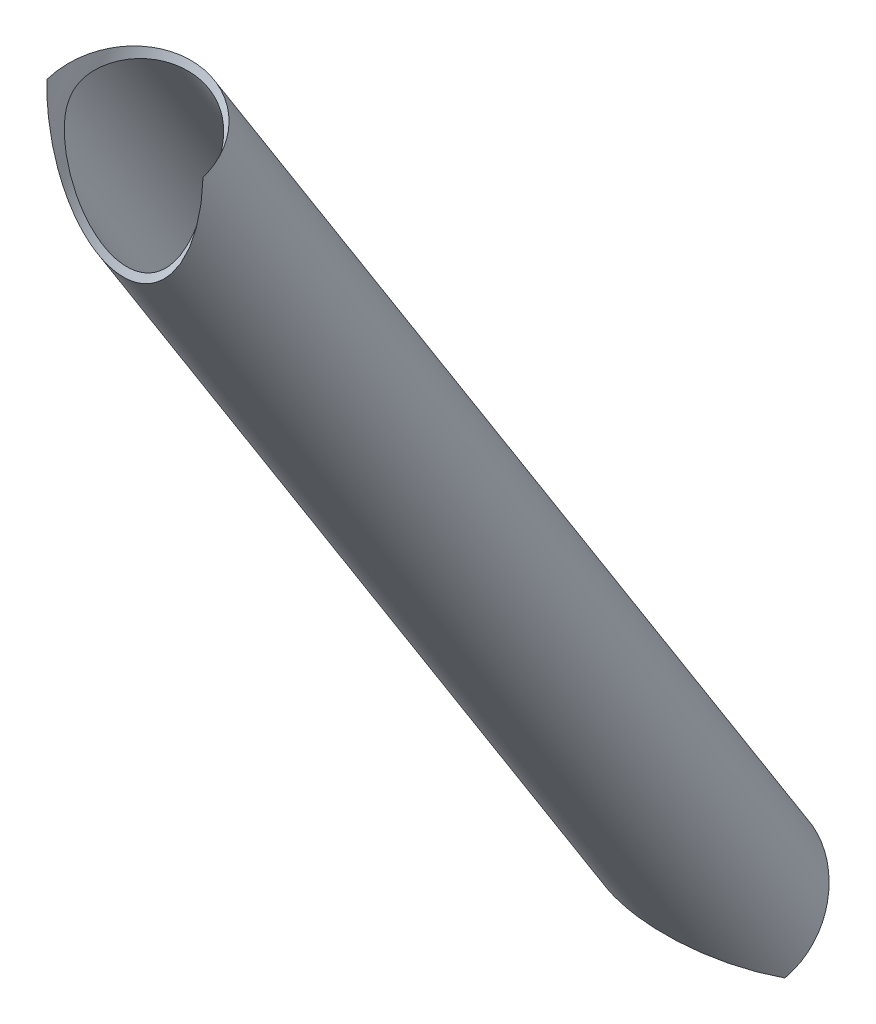
ISO-10303-21;
HEADER;
FILE_DESCRIPTION(('STEP AP214'),'2;1');
FILE_NAME('part.step','',(''),(''),'','','');
FILE_SCHEMA(('AUTOMOTIVE_DESIGN { 1 0 10303 214 1 1 1 1 }'));
ENDSEC;
DATA;
#1=APPLICATION_CONTEXT('core data for automotive mechanical design processes');
#2=APPLICATION_PROTOCOL_DEFINITION('international standard','automotive_design',2000,#1);
#3=PRODUCT_CONTEXT('',#1,'mechanical');
#4=PRODUCT('Part','Part','',(#3));
#5=PRODUCT_RELATED_PRODUCT_CATEGORY('part','',(#4));
#6=PRODUCT_DEFINITION_FORMATION('','',#4);
#7=PRODUCT_DEFINITION_CONTEXT('part definition',#1,'design');
#8=PRODUCT_DEFINITION('design','',#6,#7);
#9=PRODUCT_DEFINITION_SHAPE('','',#8);
#10=(LENGTH_UNIT() NAMED_UNIT(*) SI_UNIT(.MILLI.,.METRE.));
#11=(NAMED_UNIT(*) PLANE_ANGLE_UNIT() SI_UNIT($,.RADIAN.));
#12=(NAMED_UNIT(*) SI_UNIT($,.STERADIAN.) SOLID_ANGLE_UNIT());
#13=UNCERTAINTY_MEASURE_WITH_UNIT(LENGTH_MEASURE(1.E-05),#10,'distance_accuracy_value','');
#14=(GEOMETRIC_REPRESENTATION_CONTEXT(3) GLOBAL_UNCERTAINTY_ASSIGNED_CONTEXT((#13)) GLOBAL_UNIT_ASSIGNED_CONTEXT((#10,
#11,#12)) REPRESENTATION_CONTEXT('',''));
#15=CARTESIAN_POINT('',(0.,0.,0.));
#16=DIRECTION('',(0.,0.,1.));
#17=DIRECTION('',(1.,0.,0.));
#18=AXIS2_PLACEMENT_3D('',#15,#16,#17);
#19=CARTESIAN_POINT('',(-182.5,460.,-1823.25662851832));
#20=DIRECTION('',(-0.220873286514699,-0.785327240941153,-0.578339101168122));
#21=DIRECTION('',(0.,0.592984323970811,-0.805214003557366));
#22=AXIS2_PLACEMENT_3D('',#19,#20,#21);
#23=CYLINDRICAL_SURFACE('',#22,11.3);
#24=CARTESIAN_POINT('',(-184.024204881158,461.281327727865,-1836.34655578851));
#25=CARTESIAN_POINT('',(-184.323553613901,461.335954504744,-1836.30632737413));
#26=CARTESIAN_POINT('',(-184.621930067285,461.386594875416,-1836.25349007966));
#27=CARTESIAN_POINT('',(-185.214539448558,461.479495202312,-1836.12305444516));
#28=CARTESIAN_POINT('',(-185.508772469279,461.521755346569,-1836.04545666079));
#29=CARTESIAN_POINT('',(-186.090963235994,461.597484679827,-1835.86625950878));
#30=CARTESIAN_POINT('',(-186.378921455805,461.630954534719,-1835.76466196028));
#31=CARTESIAN_POINT('',(-186.946612850392,461.688697408685,-1835.53848804046));
#32=CARTESIAN_POINT('',(-187.226345963661,461.712970359001,-1835.41391149734));
#33=CARTESIAN_POINT('',(-187.775279880089,461.751858964316,-1835.14329734052));
#34=CARTESIAN_POINT('',(-188.04449896651,461.766492156477,-1834.99729929318));
#35=CARTESIAN_POINT('',(-188.571348461809,461.785713959871,-1834.68514466943));
#36=CARTESIAN_POINT('',(-188.828978853616,461.790302556306,-1834.51898806334));
#37=CARTESIAN_POINT('',(-189.331357114136,461.788907778094,-1834.16810242285));
#38=CARTESIAN_POINT('',(-189.576100456341,461.782920713975,-1833.98336692814));
#39=CARTESIAN_POINT('',(-190.051444188771,461.759722834002,-1833.59717825439));
#40=CARTESIAN_POINT('',(-190.282044515489,461.742511967751,-1833.39572500027));
#41=CARTESIAN_POINT('',(-190.735829756907,461.695240267927,-1832.97087162092));
#42=CARTESIAN_POINT('',(-190.958487513457,461.664758170798,-1832.74695519856));
#43=CARTESIAN_POINT('',(-191.386880854566,461.589670742868,-1832.28565147192));
#44=CARTESIAN_POINT('',(-191.5926141984,461.54506354574,-1832.04826239091));
#45=CARTESIAN_POINT('',(-191.986565554855,461.440034695859,-1831.56266087408));
#46=CARTESIAN_POINT('',(-192.174782170627,461.379611783365,-1831.31444757739));
#47=CARTESIAN_POINT('',(-192.533285443976,461.240617421031,-1830.81032426458));
#48=CARTESIAN_POINT('',(-192.703577936949,461.162051904488,-1830.55441678847));
#49=CARTESIAN_POINT('',(-192.977845384662,461.010219880977,-1830.11592165355));
#50=CARTESIAN_POINT('',(-193.086418185348,460.942400757102,-1829.93430496298));
#51=CARTESIAN_POINT('',(-193.294731563619,460.794759771125,-1829.57083901728));
#52=CARTESIAN_POINT('',(-193.394472296704,460.714938120409,-1829.3889897663));
#53=CARTESIAN_POINT('',(-193.584993060671,460.54172302272,-1829.02751104852));
#54=CARTESIAN_POINT('',(-193.675788582601,460.448353756299,-1828.84787823285));
#55=CARTESIAN_POINT('',(-193.848691834266,460.24602714701,-1828.49324986406));
#56=CARTESIAN_POINT('',(-193.930802458362,460.137075025996,-1828.31825278069));
#57=CARTESIAN_POINT('',(-194.06667551204,459.931692485741,-1828.01983334388));
#58=CARTESIAN_POINT('',(-194.122336072138,459.839126269199,-1827.89461469224));
#59=CARTESIAN_POINT('',(-194.228984149652,459.64375151545,-1827.65034924495));
#60=CARTESIAN_POINT('',(-194.279973136397,459.540946220074,-1827.53130051386));
#61=CARTESIAN_POINT('',(-194.377309978102,459.32503336055,-1827.30131631877));
#62=CARTESIAN_POINT('',(-194.423666293213,459.211945323999,-1827.19036616897));
#63=CARTESIAN_POINT('',(-194.511996792571,458.975549814307,-1826.97799854435));
#64=CARTESIAN_POINT('',(-194.553971099055,458.852242626401,-1826.87658080363));
#65=CARTESIAN_POINT('',(-194.633863723794,458.595823565967,-1826.68431331347));
#66=CARTESIAN_POINT('',(-194.671769957443,458.462684361917,-1826.59349498429));
#67=CARTESIAN_POINT('',(-194.743661025288,458.188177346002,-1826.42351607816));
#68=CARTESIAN_POINT('',(-194.777645787834,458.046809383857,-1826.34435571421));
#69=CARTESIAN_POINT('',(-194.842055684005,457.757182614636,-1826.19768579186));
#70=CARTESIAN_POINT('',(-194.872476449364,457.60891565619,-1826.13019048377));
#71=CARTESIAN_POINT('',(-194.930061181261,457.30712897592,-1826.00643677696));
#72=CARTESIAN_POINT('',(-194.957223852073,457.153607195274,-1825.950182843));
#73=CARTESIAN_POINT('',(-195.023626935419,456.751922618083,-1825.8182083421));
#74=CARTESIAN_POINT('',(-195.060661730889,456.500827561612,-1825.75029329837));
#75=CARTESIAN_POINT('',(-195.128517738162,455.992973988207,-1825.63598739043));
#76=CARTESIAN_POINT('',(-195.159334143702,455.736211259412,-1825.58961313957));
#77=CARTESIAN_POINT('',(-195.215689455789,455.218383336576,-1825.51391011556));
#78=CARTESIAN_POINT('',(-195.241201468676,454.957303131944,-1825.48466690071));
#79=CARTESIAN_POINT('',(-195.28730305673,454.433675944943,-1825.43994767855));
#80=CARTESIAN_POINT('',(-195.307894094135,454.171129422071,-1825.42446757788));
#81=CARTESIAN_POINT('',(-195.340971559691,453.696122332912,-1825.4063507416));
#82=CARTESIAN_POINT('',(-195.354255204053,453.48378218387,-1825.40181086279));
#83=CARTESIAN_POINT('',(-195.377955818773,453.058890911858,-1825.3986740033));
#84=CARTESIAN_POINT('',(-195.38837256219,452.846339773523,-1825.40007749295));
#85=CARTESIAN_POINT('',(-195.41543240481,452.208472235557,-1825.41174057995));
#86=CARTESIAN_POINT('',(-195.427873681919,451.783107967822,-1825.42945752713));
#87=CARTESIAN_POINT('',(-195.44167149081,450.932282751536,-1825.47931061697));
#88=CARTESIAN_POINT('',(-195.443006089253,450.506823270153,-1825.5114751587));
#89=CARTESIAN_POINT('',(-195.434262975122,449.657089222422,-1825.58665943162));
#90=CARTESIAN_POINT('',(-195.424187803973,449.232814413296,-1825.6296767438));
#91=CARTESIAN_POINT('',(-195.392117567108,448.385997095791,-1825.72409466736));
#92=CARTESIAN_POINT('',(-195.370131852838,447.963453490065,-1825.77548867974));
#93=CARTESIAN_POINT('',(-195.313498875732,447.120052311968,-1825.88499828641));
#94=CARTESIAN_POINT('',(-195.278850598224,446.699194877445,-1825.94311441909));
#95=CARTESIAN_POINT('',(-195.195980551839,445.86018603833,-1826.06476928709));
#96=CARTESIAN_POINT('',(-195.147777239284,445.442031739699,-1826.12830056781));
#97=CARTESIAN_POINT('',(-195.03657119588,444.608461561789,-1826.25995622661));
#98=CARTESIAN_POINT('',(-194.973570343192,444.193045341855,-1826.32808002099));
#99=CARTESIAN_POINT('',(-194.835257111015,443.388954942772,-1826.46430756217));
#100=CARTESIAN_POINT('',(-194.760837343819,443.000091700452,-1826.53219659299));
#101=CARTESIAN_POINT('',(-194.595874691941,442.226269317608,-1826.67102948074));
#102=CARTESIAN_POINT('',(-194.505329740377,441.84131068426,-1826.74197372838));
#103=CARTESIAN_POINT('',(-194.305903568722,441.075548098076,-1826.88671669953));
#104=CARTESIAN_POINT('',(-194.196974323796,440.694757882659,-1826.96052249886));
#105=CARTESIAN_POINT('',(-193.958504176332,439.940143668228,-1827.110440644));
#106=CARTESIAN_POINT('',(-193.828965889813,439.566318791783,-1827.18655269607));
#107=CARTESIAN_POINT('',(-193.543752991829,438.821691282313,-1827.34203581847));
#108=CARTESIAN_POINT('',(-193.387666700964,438.451051559366,-1827.4214404404));
#109=CARTESIAN_POINT('',(-193.0467863388,437.723052788229,-1827.58179537061));
#110=CARTESIAN_POINT('',(-192.861972264935,437.365703210181,-1827.66274672113));
#111=CARTESIAN_POINT('',(-192.460022967745,436.67268810011,-1827.82485146023));
#112=CARTESIAN_POINT('',(-192.243108135542,436.336895497729,-1827.90600002485));
#113=CARTESIAN_POINT('',(-191.77080699035,435.69387170632,-1828.0676638966));
#114=CARTESIAN_POINT('',(-191.515501191727,435.386582869243,-1828.14818016648));
#115=CARTESIAN_POINT('',(-191.013610099314,434.868050864994,-1828.29153035546));
#116=CARTESIAN_POINT('',(-190.774664950983,434.649671246928,-1828.35480547421));
#117=CARTESIAN_POINT('',(-190.3937616649,434.349950688631,-1828.44709712122));
#118=CARTESIAN_POINT('',(-190.263014928293,434.254667337109,-1828.4774305786));
#119=CARTESIAN_POINT('',(-189.99415184129,434.07478418174,-1828.53694556083));
#120=CARTESIAN_POINT('',(-189.856038746597,433.990179712912,-1828.56612758481));
#121=CARTESIAN_POINT('',(-189.571228767432,433.832185505735,-1828.62335429927));
#122=CARTESIAN_POINT('',(-189.424454041853,433.758929675938,-1828.65138290593));
#123=CARTESIAN_POINT('',(-189.124468605747,433.626161737599,-1828.70561974174));
#124=CARTESIAN_POINT('',(-188.971258078392,433.566649238215,-1828.73182802263));
#125=CARTESIAN_POINT('',(-188.659624208332,433.462567635358,-1828.78207653217));
#126=CARTESIAN_POINT('',(-188.501205199975,433.417986435664,-1828.8061185042));
#127=CARTESIAN_POINT('',(-188.180438596785,433.344469790881,-1828.85177396443));
#128=CARTESIAN_POINT('',(-188.018091353504,433.315532951088,-1828.87338766899));
#129=CARTESIAN_POINT('',(-187.708603863055,433.275811873422,-1828.91180244538));
#130=CARTESIAN_POINT('',(-187.561700920985,433.263413101788,-1828.92887106665));
#131=CARTESIAN_POINT('',(-187.267094578329,433.251108974171,-1828.96083635917));
#132=CARTESIAN_POINT('',(-187.11939093017,433.251207732027,-1828.97573231362));
#133=CARTESIAN_POINT('',(-186.824253962499,433.263447903108,-1829.00333076788));
#134=CARTESIAN_POINT('',(-186.676820723186,433.275592444958,-1829.01603269683));
#135=CARTESIAN_POINT('',(-186.38315030546,433.311232094941,-1829.03928166021));
#136=CARTESIAN_POINT('',(-186.236913430736,433.334729999371,-1829.04982816285));
#137=CARTESIAN_POINT('',(-185.896838025338,433.402052881103,-1829.07209304553));
#138=CARTESIAN_POINT('',(-185.703771713697,433.450077015056,-1829.08298469941));
#139=CARTESIAN_POINT('',(-185.322413548664,433.562837609609,-1829.10133310069));
#140=CARTESIAN_POINT('',(-185.134123662939,433.627580838751,-1829.10878845353));
#141=CARTESIAN_POINT('',(-184.76275151363,433.771729964939,-1829.12061421603));
#142=CARTESIAN_POINT('',(-184.579680412184,433.851164913207,-1829.12497842926));
#143=CARTESIAN_POINT('',(-184.219552565323,434.022581871834,-1829.13094573303));
#144=CARTESIAN_POINT('',(-184.042495034737,434.114562236255,-1829.13254918541));
#145=CARTESIAN_POINT('',(-183.580331806408,434.373161962412,-1829.13358701609));
#146=CARTESIAN_POINT('',(-183.300469695927,434.549188360019,-1829.13091090311));
#147=CARTESIAN_POINT('',(-182.756789063116,434.924360380736,-1829.12023793645));
#148=CARTESIAN_POINT('',(-182.492982106306,435.123522376346,-1829.11223729555));
#149=CARTESIAN_POINT('',(-181.980261784154,435.540253682141,-1829.09198769778));
#150=CARTESIAN_POINT('',(-181.731360347349,435.757837407392,-1829.07973539028));
#151=CARTESIAN_POINT('',(-181.247393010734,436.207764013264,-1829.05185797752));
#152=CARTESIAN_POINT('',(-181.012332533002,436.440112604757,-1829.03623156152));
#153=CARTESIAN_POINT('',(-180.553724607116,436.918125448764,-1829.00223630055));
#154=CARTESIAN_POINT('',(-180.330247565773,437.163855889459,-1828.98385284957));
#155=CARTESIAN_POINT('',(-179.895168800628,437.665362320088,-1828.94502487246));
#156=CARTESIAN_POINT('',(-179.683565594136,437.921137048978,-1828.92458060456));
#157=CARTESIAN_POINT('',(-179.271045848788,438.44147687697,-1828.8821388123));
#158=CARTESIAN_POINT('',(-179.07014144505,438.706051427235,-1828.86013958736));
#159=CARTESIAN_POINT('',(-178.678469789681,439.242504483613,-1828.81509129847));
#160=CARTESIAN_POINT('',(-178.48770279988,439.514383178105,-1828.79204220743));
#161=CARTESIAN_POINT('',(-178.114239676099,440.066545329546,-1828.74517729743));
#162=CARTESIAN_POINT('',(-177.931614885427,440.346876561172,-1828.72135702139));
#163=CARTESIAN_POINT('',(-177.575402276014,440.913197498366,-1828.67358166956));
#164=CARTESIAN_POINT('',(-177.401814368829,441.199187148519,-1828.64962659509));
#165=CARTESIAN_POINT('',(-177.063371262753,441.77592825676,-1828.60209038857));
#166=CARTESIAN_POINT('',(-176.898507568301,442.066674707458,-1828.57850890902));
#167=CARTESIAN_POINT('',(-176.576955647996,442.652724878293,-1828.53222578191));
#168=CARTESIAN_POINT('',(-176.420267601563,442.948028698262,-1828.50952415368));
#169=CARTESIAN_POINT('',(-176.090789723206,443.589542151207,-1828.46215311565));
#170=CARTESIAN_POINT('',(-175.919339100287,443.936458751375,-1828.4377351139));
#171=CARTESIAN_POINT('',(-175.586756400804,444.635427555288,-1828.39201488753));
#172=CARTESIAN_POINT('',(-175.425624908236,444.987480048311,-1828.37071283916));
#173=CARTESIAN_POINT('',(-175.113209949709,445.697357478158,-1828.33262281977));
#174=CARTESIAN_POINT('',(-174.961955345069,446.055195826066,-1828.31584766534));
#175=CARTESIAN_POINT('',(-174.670040705765,446.775374663911,-1828.28884212824));
#176=CARTESIAN_POINT('',(-174.529379342255,447.137714582492,-1828.27861092348));
#177=CARTESIAN_POINT('',(-174.260793126265,447.862587780797,-1828.26745339808));
#178=CARTESIAN_POINT('',(-174.132741773627,448.225072134413,-1828.26642272691));
#179=CARTESIAN_POINT('',(-173.888741119306,448.954182268867,-1828.2771207166));
#180=CARTESIAN_POINT('',(-173.772798818823,449.320810311234,-1828.2888567146));
#181=CARTESIAN_POINT('',(-173.555788004804,450.055761253074,-1828.33041216395));
#182=CARTESIAN_POINT('',(-173.454651792921,450.42406795608,-1828.36014589816));
#183=CARTESIAN_POINT('',(-173.316698194693,450.977503059384,-1828.4241353543));
#184=CARTESIAN_POINT('',(-173.273024357015,451.162048894967,-1828.44867907289));
#185=CARTESIAN_POINT('',(-173.191003345482,451.531112214425,-1828.50551539058));
#186=CARTESIAN_POINT('',(-173.152654495117,451.715629688871,-1828.53780554204));
#187=CARTESIAN_POINT('',(-173.096476169802,452.009504996595,-1828.59663287838));
#188=CARTESIAN_POINT('',(-173.076621843142,452.119069967086,-1828.62021267718));
#189=CARTESIAN_POINT('',(-173.039383456606,452.337789933373,-1828.6709425351));
#190=CARTESIAN_POINT('',(-173.02199942356,452.446944924704,-1828.698092633));
#191=CARTESIAN_POINT('',(-172.973948391768,452.773513741282,-1828.78540181488));
#192=CARTESIAN_POINT('',(-172.94738041014,452.990041910602,-1828.85142181865));
#193=CARTESIAN_POINT('',(-172.907845513618,453.416342704544,-1829.0007518522));
#194=CARTESIAN_POINT('',(-172.894765191016,453.626157041145,-1829.08391054139));
#195=CARTESIAN_POINT('',(-172.884356133812,454.037714070135,-1829.2690911919));
#196=CARTESIAN_POINT('',(-172.887018403501,454.239461305919,-1829.37110234817));
#197=CARTESIAN_POINT('',(-172.907244754605,454.583800767275,-1829.56620405845));
#198=CARTESIAN_POINT('',(-172.921021286537,454.728832519079,-1829.6554155238));
#199=CARTESIAN_POINT('',(-172.959140785532,455.011282879307,-1829.84311808181));
#200=CARTESIAN_POINT('',(-172.983482228512,455.148702582613,-1829.94160783439));
#201=CARTESIAN_POINT('',(-173.042889780948,455.415788805095,-1830.1466605669));
#202=CARTESIAN_POINT('',(-173.077997838357,455.545422584214,-1830.25325387537));
#203=CARTESIAN_POINT('',(-173.158593140627,455.7962611455,-1830.47229972145));
#204=CARTESIAN_POINT('',(-173.204083877983,455.917463073446,-1830.58475422078));
#205=CARTESIAN_POINT('',(-173.320475739421,456.187914888774,-1830.84895264881));
#206=CARTESIAN_POINT('',(-173.394886027234,456.33427400906,-1831.00210934235));
#207=CARTESIAN_POINT('',(-173.559135704425,456.6145582875,-1831.31146287928));
#208=CARTESIAN_POINT('',(-173.648980841848,456.748478784695,-1831.46766083599));
#209=CARTESIAN_POINT('',(-173.842857649138,457.005853656763,-1831.78036119086));
#210=CARTESIAN_POINT('',(-173.946913309874,457.129289747208,-1831.93686365297));
#211=CARTESIAN_POINT('',(-174.167861140005,457.367117711186,-1832.24759456421));
#212=CARTESIAN_POINT('',(-174.284753455221,457.481509481952,-1832.40182298748));
#213=CARTESIAN_POINT('',(-174.581036329476,457.748384543898,-1832.76904381422));
#214=CARTESIAN_POINT('',(-174.766316245859,457.897114105605,-1832.98003098766));
#215=CARTESIAN_POINT('',(-175.158076349969,458.182676591126,-1833.39008522126));
#216=CARTESIAN_POINT('',(-175.364563680331,458.31950547796,-1833.58914822939));
#217=CARTESIAN_POINT('',(-175.796693971971,458.583407155945,-1833.97234569469));
#218=CARTESIAN_POINT('',(-176.022335527147,458.710480661932,-1834.15648124574));
#219=CARTESIAN_POINT('',(-176.490972308498,458.956328087368,-1834.50739232447));
#220=CARTESIAN_POINT('',(-176.733967803716,459.075101878088,-1834.67416758291));
#221=CARTESIAN_POINT('',(-177.238389896095,459.306545962066,-1834.99002908412));
#222=CARTESIAN_POINT('',(-177.499993706361,459.419132140122,-1835.13889419564));
#223=CARTESIAN_POINT('',(-178.037297234494,459.637237679596,-1835.4148043133));
#224=CARTESIAN_POINT('',(-178.312997361464,459.742756835709,-1835.54184868569));
#225=CARTESIAN_POINT('',(-178.876429116432,459.946881634385,-1835.77239257262));
#226=CARTESIAN_POINT('',(-179.164156738075,460.045489550242,-1835.87589985452));
#227=CARTESIAN_POINT('',(-179.749620978366,460.235789042973,-1836.0579782544));
#228=CARTESIAN_POINT('',(-180.047357334787,460.327480800844,-1836.13655002512));
#229=CARTESIAN_POINT('',(-180.646410625964,460.502522963289,-1836.26667343297));
#230=CARTESIAN_POINT('',(-180.947620807109,460.585971331617,-1836.31858433226));
#231=CARTESIAN_POINT('',(-181.55530010302,460.745637183415,-1836.39616516397));
#232=CARTESIAN_POINT('',(-181.861769188144,460.821854707626,-1836.42183524425));
#233=CARTESIAN_POINT('',(-182.477536729049,460.966670481964,-1836.44639706782));
#234=CARTESIAN_POINT('',(-182.786834867546,461.035269575445,-1836.44529177811));
#235=CARTESIAN_POINT('',(-183.405834890846,461.164434390421,-1836.41611122981));
#236=CARTESIAN_POINT('',(-183.715536766043,461.225000299652,-1836.38803660163));
#237=CARTESIAN_POINT('',(-184.024204881158,461.281327727865,-1836.34655578851));
#238=B_SPLINE_CURVE_WITH_KNOTS('',3,(#24,#25,#26,#27,#28,#29,#30,#31,#32,#33,#34,#35,#36,#37,
#38,#39,#40,#41,#42,#43,#44,#45,#46,#47,#48,#49,#50,#51,#52,#53,#54,#55,#56,#57,#58,#59,#60,#61,
#62,#63,#64,#65,#66,#67,#68,#69,#70,#71,#72,#73,#74,#75,#76,#77,#78,#79,#80,#81,#82,#83,#84,#85,
#86,#87,#88,#89,#90,#91,#92,#93,#94,#95,#96,#97,#98,#99,#100,#101,#102,#103,#104,#105,#106,#107,
#108,#109,#110,#111,#112,#113,#114,#115,#116,#117,#118,#119,#120,#121,#122,#123,#124,#125,#126,
#127,#128,#129,#130,#131,#132,#133,#134,#135,#136,#137,#138,#139,#140,#141,#142,#143,#144,#145,
#146,#147,#148,#149,#150,#151,#152,#153,#154,#155,#156,#157,#158,#159,#160,#161,#162,#163,#164,
#165,#166,#167,#168,#169,#170,#171,#172,#173,#174,#175,#176,#177,#178,#179,#180,#181,#182,#183,
#184,#185,#186,#187,#188,#189,#190,#191,#192,#193,#194,#195,#196,#197,#198,#199,#200,#201,#202,
#203,#204,#205,#206,#207,#208,#209,#210,#211,#212,#213,#214,#215,#216,#217,#218,#219,#220,#221,
#222,#223,#224,#225,#226,#227,#228,#229,#230,#231,#232,#233,#234,#235,#236,#237),.UNSPECIFIED.,
.T.,.F.,(4,2,2,2,2,2,2,2,2,2,2,2,2,2,2,2,2,2,2,2,2,2,2,2,2,2,2,2,2,2,2,2,2,2,2,2,2,2,2,2,2,2,2,
2,2,2,2,2,2,2,2,2,2,2,2,2,2,2,2,2,2,2,2,2,2,2,2,2,2,2,2,2,2,2,2,2,2,2,2,2,2,2,2,2,2,2,2,2,2,2,2,
2,2,2,2,2,2,2,2,2,2,2,2,2,2,2,4),(0.,0.92052570416241,1.84103075158647,2.7614660479047,
3.68190822549809,4.60067122690801,5.51943558177392,6.43852052417212,7.35760959339941,
8.30828313149116,9.25908233308798,10.2099572900627,11.1605217153304,11.8266861190854,
12.4928387919232,13.1578167790718,13.8225724501768,14.318238878774,14.8137488685436,
15.3083367593133,15.8029108498413,16.2989156660686,16.7949295435874,17.2915451448889,
17.7883575971652,18.5751827178195,19.3626136744404,20.1539445246176,20.9450399424328,
21.5833396418617,22.2216898539782,23.4988897001892,24.7786111487114,26.0580476066338,
27.3364809804848,28.6150168199196,29.8918201847587,31.1684615803894,32.373242528722,
33.5781780137737,34.7863112728946,35.9942912992153,37.2230740604308,38.4527162622608,
39.6742774611256,40.8933116125201,41.8796207569269,42.3729934395249,42.8661498449209,
43.3647426369653,43.8633212479308,44.3614949652283,44.8596242626478,45.3043077147551,
45.7491375446644,46.1940829395411,46.6391379789332,47.235955196124,47.8330144080276,
48.4312671108228,49.0294413992749,50.0196757170022,51.0106151182579,52.0023372294453,
52.9944452895453,53.9920081544143,54.9894461747046,55.9879924418853,56.9865644871016,
57.9926332427011,58.9986921501598,60.0037526232488,61.0088351439162,62.1718669105648,
63.3349644393646,64.5013211915956,65.6675313881589,66.8204976308781,67.9741268463827,
69.1223044782606,69.6958044491514,70.2691234489711,70.610502874598,70.9518860079232,
71.6346196954541,72.3115647786257,72.988123075893,73.4998932184613,74.0115895581476,
74.5253054129511,75.0391943252961,75.7117114164357,76.3844795027456,77.0583977613918,
77.7323236763139,78.6842680603263,79.6365341161924,80.5887303270975,81.5409413034367,
82.5039100376768,83.4669067351494,84.4295851758018,85.3922384141569,86.3415548306156,
87.2908658980432,88.2400717724863,89.1892554600681),.UNSPECIFIED.);
#239=CARTESIAN_POINT('',(-184.024204881158,461.281327727865,-1836.34655578851));
#240=VERTEX_POINT('',#239);
#241=EDGE_CURVE('E80',#240,#240,#238,.T.);
#242=ORIENTED_EDGE('',*,*,#241,.T.);
#243=EDGE_LOOP('',(#242));
#244=FACE_BOUND('',#243,.T.);
#245=CARTESIAN_POINT('',(-248.652133245785,231.493137986969,-2005.56963654467));
#246=CARTESIAN_POINT('',(-248.344591968084,231.467558774613,-2005.58847293435));
#247=CARTESIAN_POINT('',(-248.037241936959,231.432918985753,-2005.59844145418));
#248=CARTESIAN_POINT('',(-247.42503535534,231.344993202105,-2005.60095539947));
#249=CARTESIAN_POINT('',(-247.120179751175,231.291700438536,-2005.59349449457));
#250=CARTESIAN_POINT('',(-246.514844717556,231.166163903714,-2005.56142533464));
#251=CARTESIAN_POINT('',(-246.214372172324,231.09389313114,-2005.53679256472));
#252=CARTESIAN_POINT('',(-245.620507857101,230.930512312605,-2005.47070295683));
#253=CARTESIAN_POINT('',(-245.327115414717,230.839404063557,-2005.42924772319));
#254=CARTESIAN_POINT('',(-244.749456549191,230.638652212815,-2005.32989858242));
#255=CARTESIAN_POINT('',(-244.465193970023,230.529000922532,-2005.27199784961));
#256=CARTESIAN_POINT('',(-243.90804544146,230.291811456818,-2005.14024341628));
#257=CARTESIAN_POINT('',(-243.635159772992,230.164272840039,-2005.0663893221));
#258=CARTESIAN_POINT('',(-243.102895159886,229.892251981742,-2004.90331832425));
#259=CARTESIAN_POINT('',(-242.843511016039,229.747776333144,-2004.8141073921));
#260=CARTESIAN_POINT('',(-242.340005386338,229.44297569985,-2004.62093018632));
#261=CARTESIAN_POINT('',(-242.095883682836,229.282650941254,-2004.51696412315));
#262=CARTESIAN_POINT('',(-241.627795571903,228.949792899804,-2004.29646847123));
#263=CARTESIAN_POINT('',(-241.403599954006,228.77745561466,-2004.18012926218));
#264=CARTESIAN_POINT('',(-240.973110091584,228.420176042818,-2003.93443294608));
#265=CARTESIAN_POINT('',(-240.766815705061,228.235233856127,-2003.80507594231));
#266=CARTESIAN_POINT('',(-240.373313938061,227.854393332461,-2003.53400389497));
#267=CARTESIAN_POINT('',(-240.186108178562,227.658494067211,-2003.39228780377));
#268=CARTESIAN_POINT('',(-239.83178628429,227.257577263465,-2003.09713585499));
#269=CARTESIAN_POINT('',(-239.664670359982,227.052559629475,-2002.94369987465));
#270=CARTESIAN_POINT('',(-239.34803831863,226.631049434693,-2002.62234582031));
#271=CARTESIAN_POINT('',(-239.198959949044,226.414406969947,-2002.45419310912));
#272=CARTESIAN_POINT('',(-238.923119113661,225.975962621133,-2002.10666516336));
#273=CARTESIAN_POINT('',(-238.796357894022,225.754160449736,-2001.92728930287));
#274=CARTESIAN_POINT('',(-238.565466515435,225.307807218433,-2001.55743677489));
#275=CARTESIAN_POINT('',(-238.461349197316,225.083254674695,-2001.36695388611));
#276=CARTESIAN_POINT('',(-238.276010206444,224.634393800837,-2000.97492140319));
#277=CARTESIAN_POINT('',(-238.194785654051,224.41008544354,-2000.77337320476));
#278=CARTESIAN_POINT('',(-238.063774192523,223.99248384647,-2000.38430035119));
#279=CARTESIAN_POINT('',(-238.011346905779,223.798774374766,-2000.19810747225));
#280=CARTESIAN_POINT('',(-237.923850762824,223.416801631339,-1999.81621040698));
#281=CARTESIAN_POINT('',(-237.888783627776,223.228538901371,-1999.62050527967));
#282=CARTESIAN_POINT('',(-237.835685074515,222.861086149239,-1999.21895471516));
#283=CARTESIAN_POINT('',(-237.817632900314,222.681885326077,-1999.01312195584));
#284=CARTESIAN_POINT('',(-237.797870057334,222.336624028225,-1998.58998390346));
#285=CARTESIAN_POINT('',(-237.796151491375,222.170557241843,-1998.37268420569));
#286=CARTESIAN_POINT('',(-237.805943064446,221.910263696269,-1998.00141332138));
#287=CARTESIAN_POINT('',(-237.813159343823,221.810790850527,-1997.85099368615));
#288=CARTESIAN_POINT('',(-237.83375356419,221.621832453894,-1997.54443410759));
#289=CARTESIAN_POINT('',(-237.847129426479,221.53234354633,-1997.3882961104));
#290=CARTESIAN_POINT('',(-237.879370959446,221.365534344845,-1997.07062482052));
#291=CARTESIAN_POINT('',(-237.898223810064,221.288186276617,-1996.90910489822));
#292=CARTESIAN_POINT('',(-237.940606334025,221.147406331701,-1996.58067161256));
#293=CARTESIAN_POINT('',(-237.964135834516,221.083973940863,-1996.41375844873));
#294=CARTESIAN_POINT('',(-238.015108604795,220.972203330052,-1996.07374878998));
#295=CARTESIAN_POINT('',(-238.042586231667,220.924010944498,-1995.90060923162));
#296=CARTESIAN_POINT('',(-238.100153616057,220.844615411569,-1995.55090973716));
#297=CARTESIAN_POINT('',(-238.130243213442,220.81341122355,-1995.37435001125));
#298=CARTESIAN_POINT('',(-238.191955346344,220.768129608524,-1995.01922149922));
#299=CARTESIAN_POINT('',(-238.223578766611,220.754062191621,-1994.8406516003));
#300=CARTESIAN_POINT('',(-238.287426351203,220.742296946655,-1994.48309326488));
#301=CARTESIAN_POINT('',(-238.319650626534,220.744602173881,-1994.3041047565));
#302=CARTESIAN_POINT('',(-238.393424576608,220.766964528374,-1993.89487753341));
#303=CARTESIAN_POINT('',(-238.434953960566,220.792001278685,-1993.66491110867));
#304=CARTESIAN_POINT('',(-238.517148197282,220.862976789,-1993.20810407578));
#305=CARTESIAN_POINT('',(-238.557812631013,220.908925448817,-1992.98126500059));
#306=CARTESIAN_POINT('',(-238.638241938103,221.017993993301,-1992.53068403974));
#307=CARTESIAN_POINT('',(-238.678002570752,221.081181715672,-1992.30695813954));
#308=CARTESIAN_POINT('',(-238.756582757229,221.221235526983,-1991.86378299577));
#309=CARTESIAN_POINT('',(-238.795402493789,221.298098935359,-1991.64433292344));
#310=CARTESIAN_POINT('',(-238.894387652868,221.509766385485,-1991.08535078976));
#311=CARTESIAN_POINT('',(-238.954086729197,221.652596622761,-1990.7487897493));
#312=CARTESIAN_POINT('',(-239.073246061739,221.957662965852,-1990.08445511822));
#313=CARTESIAN_POINT('',(-239.132706139658,222.119911493588,-1989.75668731853));
#314=CARTESIAN_POINT('',(-239.252720968736,222.459219735085,-1989.10823166829));
#315=CARTESIAN_POINT('',(-239.313277821697,222.636310932254,-1988.78756078926));
#316=CARTESIAN_POINT('',(-239.436398006643,223.00165038945,-1988.15317927415));
#317=CARTESIAN_POINT('',(-239.498960846592,223.189895922962,-1987.83946696271));
#318=CARTESIAN_POINT('',(-239.627425714056,223.576634122841,-1987.21617242035));
#319=CARTESIAN_POINT('',(-239.693347094305,223.775186341785,-1986.90663124284));
#320=CARTESIAN_POINT('',(-239.828938613226,224.179817787805,-1986.29333167506));
#321=CARTESIAN_POINT('',(-239.89860893762,224.385897387624,-1985.9895735723));
#322=CARTESIAN_POINT('',(-240.04231019618,224.804176888339,-1985.38799393428));
#323=CARTESIAN_POINT('',(-240.116335021091,225.016368011086,-1985.09016483104));
#324=CARTESIAN_POINT('',(-240.26950165158,225.446344559944,-1984.49990877321));
#325=CARTESIAN_POINT('',(-240.348643493936,225.664130026257,-1984.20748185747));
#326=CARTESIAN_POINT('',(-240.524775107165,226.137126236321,-1983.58543923447));
#327=CARTESIAN_POINT('',(-240.622677602124,226.393128714359,-1983.25668252912));
#328=CARTESIAN_POINT('',(-240.827117056079,226.911091703923,-1982.60660862799));
#329=CARTESIAN_POINT('',(-240.93365426224,227.173052385845,-1982.28529164551));
#330=CARTESIAN_POINT('',(-241.156622590675,227.702807586442,-1981.65023680943));
#331=CARTESIAN_POINT('',(-241.273066306226,227.970609198812,-1981.33650927409));
#332=CARTESIAN_POINT('',(-241.516991943244,228.511359180829,-1980.71790621135));
#333=CARTESIAN_POINT('',(-241.644473403767,228.78430733518,-1980.41303031501));
#334=CARTESIAN_POINT('',(-241.910967382371,229.333030747342,-1979.81553074208));
#335=CARTESIAN_POINT('',(-242.049887260221,229.608769969184,-1979.52283290423));
#336=CARTESIAN_POINT('',(-242.341831272677,230.164827478394,-1978.94888203763));
#337=CARTESIAN_POINT('',(-242.494857775514,230.445146528105,-1978.66763094203));
#338=CARTESIAN_POINT('',(-242.81681069754,231.009423196532,-1978.11943023011));
#339=CARTESIAN_POINT('',(-242.985705443496,231.293372629305,-1977.85245372612));
#340=CARTESIAN_POINT('',(-243.342215392625,231.864824311121,-1977.33547224762));
#341=CARTESIAN_POINT('',(-243.529821188792,232.152324711843,-1977.08545885005));
#342=CARTESIAN_POINT('',(-243.862938729118,232.636707580662,-1976.68422257298));
#343=CARTESIAN_POINT('',(-244.002476486134,232.832867848248,-1976.52717213339));
#344=CARTESIAN_POINT('',(-244.292962905888,233.225990115259,-1976.22486348186));
#345=CARTESIAN_POINT('',(-244.44391393139,233.422952272662,-1976.07960772461));
#346=CARTESIAN_POINT('',(-244.758340507989,233.816545054686,-1975.80372909272));
#347=CARTESIAN_POINT('',(-244.921794906393,234.013175688236,-1975.6730823864));
#348=CARTESIAN_POINT('',(-245.262841779491,234.405080467323,-1975.42962235474));
#349=CARTESIAN_POINT('',(-245.440425989457,234.600355334237,-1975.31679871806));
#350=CARTESIAN_POINT('',(-245.849497870348,235.027674617943,-1975.09233812271));
#351=CARTESIAN_POINT('',(-246.084560784827,235.259022995292,-1974.98571580153));
#352=CARTESIAN_POINT('',(-246.578967765373,235.711405222952,-1974.8149206419));
#353=CARTESIAN_POINT('',(-246.838279389046,235.932452278207,-1974.75069198691));
#354=CARTESIAN_POINT('',(-247.329221613889,236.315884582459,-1974.68357466752));
#355=CARTESIAN_POINT('',(-247.556945186582,236.481504414162,-1974.67145309406));
#356=CARTESIAN_POINT('',(-247.906753493087,236.715531516575,-1974.68440611324));
#357=CARTESIAN_POINT('',(-248.024725493988,236.791139404301,-1974.69391275759));
#358=CARTESIAN_POINT('',(-248.262697676487,236.936800499928,-1974.72369707291));
#359=CARTESIAN_POINT('',(-248.382697013445,237.006855955101,-1974.74397036039));
#360=CARTESIAN_POINT('',(-248.624428165483,237.141012052237,-1974.79558359886));
#361=CARTESIAN_POINT('',(-248.746165545931,237.205082333349,-1974.82697647116));
#362=CARTESIAN_POINT('',(-248.989794982085,237.326289653443,-1974.90064897008));
#363=CARTESIAN_POINT('',(-249.111687034866,237.383426821559,-1974.94292839388));
#364=CARTESIAN_POINT('',(-249.354655023031,237.490393934225,-1975.03791433367));
#365=CARTESIAN_POINT('',(-249.475730688666,237.540221566586,-1975.09062413671));
#366=CARTESIAN_POINT('',(-249.716156282587,237.632414239758,-1975.20574284168));
#367=CARTESIAN_POINT('',(-249.835505329955,237.674775586542,-1975.26815651613));
#368=CARTESIAN_POINT('',(-250.089950298913,237.758061397122,-1975.41210391261));
#369=CARTESIAN_POINT('',(-250.224623897846,237.797748343457,-1975.49510179688));
#370=CARTESIAN_POINT('',(-250.489749672311,237.867643365837,-1975.67127539084));
#371=CARTESIAN_POINT('',(-250.62019901854,237.897845202127,-1975.76445774626));
#372=CARTESIAN_POINT('',(-251.004569126117,237.975171795106,-1976.05716002733));
#373=CARTESIAN_POINT('',(-251.251354540608,238.008967845477,-1976.26974347838));
#374=CARTESIAN_POINT('',(-251.672169048275,238.042808172119,-1976.66944685189));
#375=CARTESIAN_POINT('',(-251.850307722519,238.04861672833,-1976.85197061777));
#376=CARTESIAN_POINT('',(-252.19458398141,238.045020804045,-1977.22803747328));
#377=CARTESIAN_POINT('',(-252.360714138129,238.03560699039,-1977.421587253));
#378=CARTESIAN_POINT('',(-252.681815810884,238.00392985047,-1977.81703510007));
#379=CARTESIAN_POINT('',(-252.83677203473,237.981649277111,-1978.01894403445));
#380=CARTESIAN_POINT('',(-253.136306856944,237.926230469358,-1978.42894455967));
#381=CARTESIAN_POINT('',(-253.280881312407,237.893087929467,-1978.63703857239));
#382=CARTESIAN_POINT('',(-253.559273863215,237.817918135189,-1979.05600953339));
#383=CARTESIAN_POINT('',(-253.693175287323,237.775971481446,-1979.26684598006));
#384=CARTESIAN_POINT('',(-253.952424332903,237.684326567949,-1979.69199472584));
#385=CARTESIAN_POINT('',(-254.077773084891,237.634629335553,-1979.90630656091));
#386=CARTESIAN_POINT('',(-254.320784844409,237.528487839816,-1980.33786561565));
#387=CARTESIAN_POINT('',(-254.438440343384,237.472037132774,-1980.55511546046));
#388=CARTESIAN_POINT('',(-254.666577223883,237.353291134835,-1980.99178664245));
#389=CARTESIAN_POINT('',(-254.777057724939,237.290995128925,-1981.21120824235));
#390=CARTESIAN_POINT('',(-255.099534281457,237.095881024359,-1981.87399915749));
#391=CARTESIAN_POINT('',(-255.301508364183,236.955316274303,-1982.31999129052));
#392=CARTESIAN_POINT('',(-255.682189759411,236.65832684426,-1983.21608220181));
#393=CARTESIAN_POINT('',(-255.860910937502,236.501911715685,-1983.66617835991));
#394=CARTESIAN_POINT('',(-256.216417026486,236.158540097928,-1984.61924808316));
#395=CARTESIAN_POINT('',(-256.390815812286,235.970117686581,-1985.12258011637));
#396=CARTESIAN_POINT('',(-256.716814558988,235.581311691415,-1986.13208033643));
#397=CARTESIAN_POINT('',(-256.868408868593,235.380925159834,-1986.63824919416));
#398=CARTESIAN_POINT('',(-257.150621164894,234.970730122774,-1987.65412330665));
#399=CARTESIAN_POINT('',(-257.281187424535,234.76089995986,-1988.16383415897));
#400=CARTESIAN_POINT('',(-257.461434122299,234.441600269996,-1988.93006242627));
#401=CARTESIAN_POINT('',(-257.518911695961,234.334417242541,-1989.18572710871));
#402=CARTESIAN_POINT('',(-257.628659086434,234.118884558044,-1989.69770821623));
#403=CARTESIAN_POINT('',(-257.680928427627,234.010534795455,-1989.95402469864));
#404=CARTESIAN_POINT('',(-257.829314952088,233.685484471721,-1990.72124585467));
#405=CARTESIAN_POINT('',(-257.917664054292,233.467618131611,-1991.23319640902));
#406=CARTESIAN_POINT('',(-258.033437591985,233.14125823427,-1992.00376313032));
#407=CARTESIAN_POINT('',(-258.069236817876,233.032545928489,-1992.26105633076));
#408=CARTESIAN_POINT('',(-258.134882623332,232.815846653402,-1992.77670189686));
#409=CARTESIAN_POINT('',(-258.164729460755,232.707859652871,-1993.03505421615));
#410=CARTESIAN_POINT('',(-258.217898066756,232.493613633671,-1993.55224615622));
#411=CARTESIAN_POINT('',(-258.241238839302,232.387350454679,-1993.81108208647));
#412=CARTESIAN_POINT('',(-258.28081531038,232.177088727967,-1994.33020158537));
#413=CARTESIAN_POINT('',(-258.297051563907,232.073090003955,-1994.59048503932));
#414=CARTESIAN_POINT('',(-258.321448571185,231.868519789775,-1995.11255189658));
#415=CARTESIAN_POINT('',(-258.329615534067,231.767945722044,-1995.37433399044));
#416=CARTESIAN_POINT('',(-258.3365700502,231.571568134798,-1995.89978622984));
#417=CARTESIAN_POINT('',(-258.335359685617,231.475763561007,-1996.16345594326));
#418=CARTESIAN_POINT('',(-258.325837305467,231.346718172506,-1996.53280081929));
#419=CARTESIAN_POINT('',(-258.322260941777,231.310669059888,-1996.63762569822));
#420=CARTESIAN_POINT('',(-258.313203442017,231.239757156546,-1996.84759497705));
#421=CARTESIAN_POINT('',(-258.307722280467,231.204894381698,-1996.95273938119));
#422=CARTESIAN_POINT('',(-258.288187088182,231.10230318391,-1997.26867983494));
#423=CARTESIAN_POINT('',(-258.271041934335,231.036580901708,-1997.47995753679));
#424=CARTESIAN_POINT('',(-258.227016703305,230.912049039228,-1997.90329336219));
#425=CARTESIAN_POINT('',(-258.200148063935,230.853231444126,-1998.11535028025));
#426=CARTESIAN_POINT('',(-258.134800861092,230.744216273699,-1998.53992714796));
#427=CARTESIAN_POINT('',(-258.096324409899,230.694017132674,-1998.7524470064));
#428=CARTESIAN_POINT('',(-258.013994251095,230.612586513851,-1999.13755226529));
#429=CARTESIAN_POINT('',(-257.972454200994,230.579564044147,-1999.31024808401));
#430=CARTESIAN_POINT('',(-257.878996506278,230.521731552766,-1999.65423005403));
#431=CARTESIAN_POINT('',(-257.827079963353,230.496920659995,-1999.82551635297));
#432=CARTESIAN_POINT('',(-257.711869652142,230.456542602588,-2000.16497411725));
#433=CARTESIAN_POINT('',(-257.648599690502,230.440956383462,-2000.33315130327));
#434=CARTESIAN_POINT('',(-257.509820477273,230.419573091717,-2000.66504290066));
#435=CARTESIAN_POINT('',(-257.43431202864,230.413775377165,-2000.82875760399));
#436=CARTESIAN_POINT('',(-257.270192754327,230.412000953127,-2001.15102630187));
#437=CARTESIAN_POINT('',(-257.181492526631,230.416094414482,-2001.30953528953));
#438=CARTESIAN_POINT('',(-256.991730810542,230.433572286057,-2001.61842576355));
#439=CARTESIAN_POINT('',(-256.890669102898,230.446956861089,-2001.76880710568));
#440=CARTESIAN_POINT('',(-256.676858533909,230.481731720352,-2002.06043205093));
#441=CARTESIAN_POINT('',(-256.564088419909,230.503136753375,-2002.201658254));
#442=CARTESIAN_POINT('',(-256.32819774341,230.552227366986,-2002.47399549285));
#443=CARTESIAN_POINT('',(-256.205075312246,230.579914082998,-2002.60510469421));
#444=CARTESIAN_POINT('',(-255.915847446723,230.647659102966,-2002.89049759861));
#445=CARTESIAN_POINT('',(-255.7470087727,230.689050439054,-2003.04169259155));
#446=CARTESIAN_POINT('',(-255.39719085902,230.775399442992,-2003.32814227054));
#447=CARTESIAN_POINT('',(-255.21620769483,230.820358264552,-2003.46339176443));
#448=CARTESIAN_POINT('',(-254.843697492405,230.910951247689,-2003.71921288463));
#449=CARTESIAN_POINT('',(-254.652146306205,230.956586765659,-2003.83974868692));
#450=CARTESIAN_POINT('',(-254.260503207955,231.046017134134,-2004.06685258914));
#451=CARTESIAN_POINT('',(-254.060408908965,231.089811463339,-2004.17341675109));
#452=CARTESIAN_POINT('',(-253.578384298416,231.188976275241,-2004.41021395097));
#453=CARTESIAN_POINT('',(-253.293335069673,231.242707857901,-2004.53481032667));
#454=CARTESIAN_POINT('',(-252.712664716707,231.339370190185,-2004.76171415334));
#455=CARTESIAN_POINT('',(-252.417039537604,231.382296745295,-2004.86401294631));
#456=CARTESIAN_POINT('',(-251.818328634351,231.454535358087,-2005.04753035729));
#457=CARTESIAN_POINT('',(-251.515258281522,231.483873330507,-2005.12878896929));
#458=CARTESIAN_POINT('',(-250.903536687383,231.527003746961,-2005.27143474253));
#459=CARTESIAN_POINT('',(-250.594888192481,231.540803640155,-2005.33283141577));
#460=CARTESIAN_POINT('',(-250.014108317982,231.550680181051,-2005.42980414647));
#461=CARTESIAN_POINT('',(-249.742393021467,231.548810380592,-2005.46768717236));
#462=CARTESIAN_POINT('',(-249.197779456314,231.531382226488,-2005.52925098174));
#463=CARTESIAN_POINT('',(-248.924881140345,231.51582332003,-2005.5529311916));
#464=CARTESIAN_POINT('',(-248.652133245785,231.493137986969,-2005.56963654467));
#465=B_SPLINE_CURVE_WITH_KNOTS('',3,(#245,#246,#247,#248,#249,#250,#251,#252,#253,#254,#255,
#256,#257,#258,#259,#260,#261,#262,#263,#264,#265,#266,#267,#268,#269,#270,#271,#272,#273,#274,
#275,#276,#277,#278,#279,#280,#281,#282,#283,#284,#285,#286,#287,#288,#289,#290,#291,#292,#293,
#294,#295,#296,#297,#298,#299,#300,#301,#302,#303,#304,#305,#306,#307,#308,#309,#310,#311,#312,
#313,#314,#315,#316,#317,#318,#319,#320,#321,#322,#323,#324,#325,#326,#327,#328,#329,#330,#331,
#332,#333,#334,#335,#336,#337,#338,#339,#340,#341,#342,#343,#344,#345,#346,#347,#348,#349,#350,
#351,#352,#353,#354,#355,#356,#357,#358,#359,#360,#361,#362,#363,#364,#365,#366,#367,#368,#369,
#370,#371,#372,#373,#374,#375,#376,#377,#378,#379,#380,#381,#382,#383,#384,#385,#386,#387,#388,
#389,#390,#391,#392,#393,#394,#395,#396,#397,#398,#399,#400,#401,#402,#403,#404,#405,#406,#407,
#408,#409,#410,#411,#412,#413,#414,#415,#416,#417,#418,#419,#420,#421,#422,#423,#424,#425,#426,
#427,#428,#429,#430,#431,#432,#433,#434,#435,#436,#437,#438,#439,#440,#441,#442,#443,#444,#445,
#446,#447,#448,#449,#450,#451,#452,#453,#454,#455,#456,#457,#458,#459,#460,#461,#462,#463,#464),
.UNSPECIFIED.,.T.,.F.,(4,2,2,2,2,2,2,2,2,2,2,2,2,2,2,2,2,2,2,2,2,2,2,2,2,2,2,2,2,2,2,2,2,2,2,2,
2,2,2,2,2,2,2,2,2,2,2,2,2,2,2,2,2,2,2,2,2,2,2,2,2,2,2,2,2,2,2,2,2,2,2,2,2,2,2,2,2,2,2,2,2,2,2,2,
2,2,2,2,2,2,2,2,2,2,2,2,2,2,2,2,2,2,2,2,2,2,2,2,2,4),(0.,0.927299612682005,1.8549360728284,
2.78389956428883,3.71277448243899,4.64203549296098,5.57131943591828,6.50024283890107,
7.42915299202444,8.34541269676583,9.26166513279191,10.1779953109484,11.0943350878939,
12.0297112309503,12.9651395874787,13.9010970284211,14.8369366843731,15.6574722345311,
16.4780891199838,17.2977036614585,18.1169219051108,18.6579614472865,19.1988185362954,
19.7384196961443,20.2780009157449,20.822599324282,21.3671643686473,21.9120473575711,
22.4570320294339,23.1609071196781,23.8651157754602,24.5721365715288,25.2790189371316,
26.3894667637509,27.5006287815904,28.6142104612756,29.7275210561724,30.8481969300945,
31.9689283733074,33.0881233172978,34.2073263063653,35.4912057413053,36.7751219397356,
38.0606953794967,39.3462151587148,40.622190528605,41.8983805017314,43.1720752120533,
44.4451327679237,45.3070307053652,46.1691075631519,47.0297569460524,47.889906572196,
48.9269291353451,49.9625835907699,50.8043390499438,51.2252080978568,51.645905925458,
52.0686334894576,52.4913531786421,52.9142062976533,53.3372680441339,53.8258192060567,
54.3146910901141,55.2929942278291,56.0573826128314,56.8222398383359,57.5881246952407,
58.3543135037957,59.1137721036497,59.8731301207481,60.6332185315739,61.3934000400291,
62.9204360621136,64.4465573059238,66.1409439197864,67.8357497392197,69.5346629651408,
70.3839756309019,71.2333657856579,72.9229148700514,73.767672938693,74.6123944042959,
75.4546219782505,76.2967837468018,77.138296985557,77.9796233779588,78.3123274836408,
78.6450360399082,79.3105344965352,79.9752526530482,80.6398499233216,81.1814286539951,
81.7229499148865,82.2633486696788,82.803711983659,83.3479200313041,83.8921377327655,
84.4373611451334,84.9826831861743,85.6727837663159,86.3631084388939,87.0550816966027,
87.7472495728867,88.6930635007781,89.6392440296279,90.5836125948152,91.5275282242054,
92.349885486614,93.1722759601024),.UNSPECIFIED.);
#466=CARTESIAN_POINT('',(-248.652133245785,231.493137986969,-2005.56963654467));
#467=VERTEX_POINT('',#466);
#468=EDGE_CURVE('E46',#467,#467,#465,.T.);
#469=ORIENTED_EDGE('',*,*,#468,.T.);
#470=EDGE_LOOP('',(#469));
#471=FACE_BOUND('',#470,.T.);
#472=ADVANCED_FACE('F41',(#244,#471),#23,.F.);
#473=CARTESIAN_POINT('',(-182.5,460.,-1823.25662851832));
#474=DIRECTION('',(-0.220873286514699,-0.785327240941153,-0.578339101168122));
#475=DIRECTION('',(0.,0.592984323970811,-0.805214003557366));
#476=AXIS2_PLACEMENT_3D('',#473,#474,#475);
#477=CYLINDRICAL_SURFACE('',#476,12.5);
#478=CARTESIAN_POINT('',(-182.5,460.,-1823.25662851831));
#479=DIRECTION('',(-0.199819499582869,-0.963496880792618,-0.178173870950111));
#480=DIRECTION('',(-0.094113569644671,0.19987316796414,-0.97529141939049));
#481=AXIS2_PLACEMENT_3D('',#478,#479,#480);
#482=ELLIPSE('',#481,13.8298805838517,12.5);
#483=CARTESIAN_POINT('',(-170.308719793978,457.773579195531,-1824.88933710826));
#484=VERTEX_POINT('',#483);
#485=CARTESIAN_POINT('',(-194.691280206022,462.22642080447,-1821.62391992837));
#486=VERTEX_POINT('',#485);
#487=EDGE_CURVE('E70',#484,#486,#482,.F.);
#488=ORIENTED_EDGE('',*,*,#487,.F.);
#489=CARTESIAN_POINT('',(-182.5,460.,-1823.25662851831));
#490=DIRECTION('',(-0.094113569644671,0.19987316796414,-0.97529141939049));
#491=DIRECTION('',(-0.199819499582869,-0.963496880792618,-0.178173870950111));
#492=AXIS2_PLACEMENT_3D('',#489,#490,#491);
#493=ELLIPSE('',#492,29.2144473885674,12.5);
#494=EDGE_CURVE('E72',#486,#484,#493,.F.);
#495=ORIENTED_EDGE('',*,*,#494,.F.);
#496=EDGE_LOOP('',(#488,#495));
#497=FACE_BOUND('',#496,.T.);
#498=CARTESIAN_POINT('',(-250.,220.,-2000.));
#499=DIRECTION('',(-0.0269990666169395,-0.550356907278941,-0.834492854979701));
#500=DIRECTION('',(-0.502531728597138,-0.714169641222546,0.487261311114716));
#501=AXIS2_PLACEMENT_3D('',#498,#499,#500);
#502=ELLIPSE('',#501,13.5752479915945,12.5);
#503=CARTESIAN_POINT('',(-260.801713638318,225.40643421892,-2003.21612367801));
#504=VERTEX_POINT('',#503);
#505=CARTESIAN_POINT('',(-239.198286361682,214.593565781081,-1996.78387632199));
#506=VERTEX_POINT('',#505);
#507=EDGE_CURVE('E56',#504,#506,#502,.T.);
#508=ORIENTED_EDGE('',*,*,#507,.F.);
#509=CARTESIAN_POINT('',(-250.,220.,-2000.));
#510=DIRECTION('',(-0.502531728597138,-0.714169641222546,0.487261311114716));
#511=DIRECTION('',(-0.0269990666169395,-0.550356907278941,-0.834492854979701));
#512=AXIS2_PLACEMENT_3D('',#509,#510,#511);
#513=ELLIPSE('',#512,32.0471373149517,12.5);
#514=EDGE_CURVE('E11',#506,#504,#513,.T.);
#515=ORIENTED_EDGE('',*,*,#514,.F.);
#516=EDGE_LOOP('',(#508,#515));
#517=FACE_BOUND('',#516,.T.);
#518=ADVANCED_FACE('F76',(#497,#517),#477,.T.);
#519=CARTESIAN_POINT('',(-115.,920.,-1946.51325703663));
#520=DIRECTION('',(-0.140336447675245,-0.956366902675742,0.256257739239816));
#521=DIRECTION('',(0.,-0.258819045102517,-0.965925826289069));
#522=AXIS2_PLACEMENT_3D('',#519,#520,#521);
#523=CYLINDRICAL_SURFACE('',#522,12.5);
#524=ORIENTED_EDGE('',*,*,#241,.F.);
#525=EDGE_LOOP('',(#524));
#526=FACE_BOUND('',#525,.T.);
#527=ORIENTED_EDGE('',*,*,#487,.T.);
#528=ORIENTED_EDGE('',*,*,#494,.T.);
#529=EDGE_LOOP('',(#527,#528));
#530=FACE_BOUND('',#529,.T.);
#531=ADVANCED_FACE('F73',(#526,#530),#523,.F.);
#532=CARTESIAN_POINT('',(-325.,320.,-1580.));
#533=DIRECTION('',(0.171152156864514,-0.228202875819352,-0.958452078441276));
#534=DIRECTION('',(0.,0.972806214685367,-0.23162052730604));
#535=AXIS2_PLACEMENT_3D('',#532,#533,#534);
#536=CYLINDRICAL_SURFACE('',#535,12.5);
#537=ORIENTED_EDGE('',*,*,#468,.F.);
#538=EDGE_LOOP('',(#537));
#539=FACE_BOUND('',#538,.T.);
#540=ORIENTED_EDGE('',*,*,#507,.T.);
#541=ORIENTED_EDGE('',*,*,#514,.T.);
#542=EDGE_LOOP('',(#540,#541));
#543=FACE_BOUND('',#542,.T.);
#544=ADVANCED_FACE('F43',(#539,#543),#536,.F.);
#545=CLOSED_SHELL('',(#472,#518,#531,#544));
#546=MANIFOLD_SOLID_BREP('B2',#545);
#547=ADVANCED_BREP_SHAPE_REPRESENTATION('',(#18,#546),#14);
#548=SHAPE_DEFINITION_REPRESENTATION(#9,#547);
ENDSEC;
END-ISO-10303-21;
